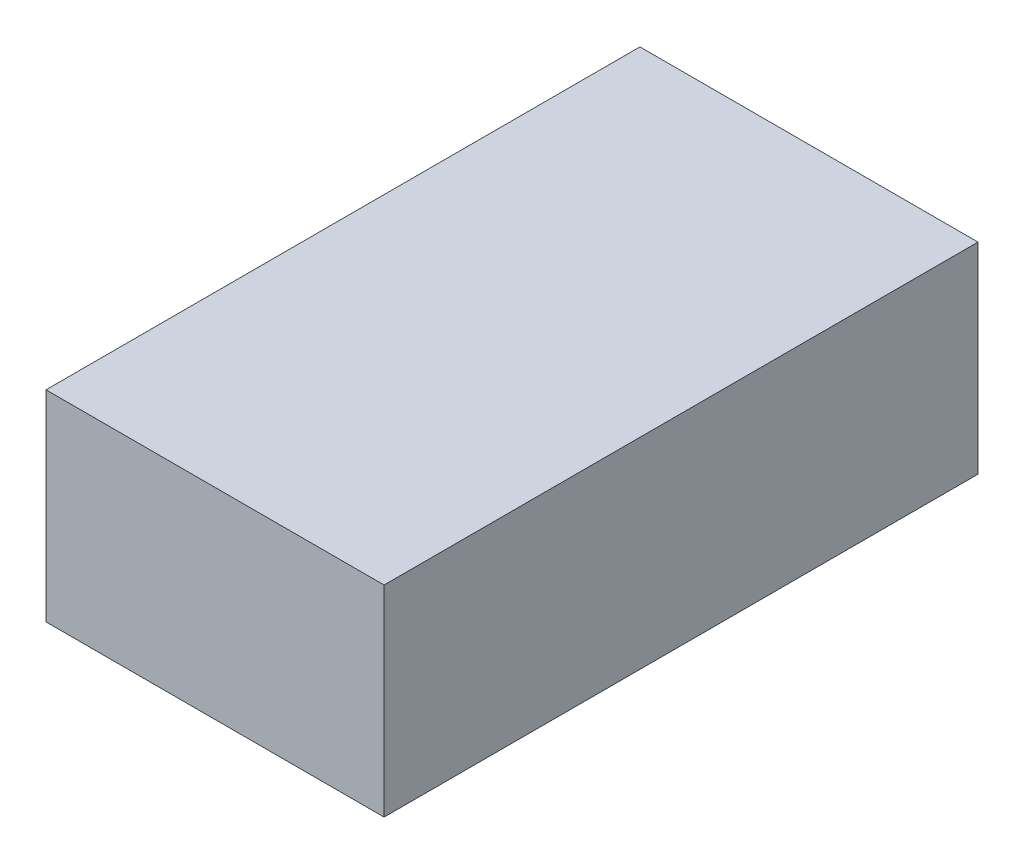
ISO-10303-21;
HEADER;
FILE_DESCRIPTION(('STEP AP214'),'2;1');
FILE_NAME('part.step','',(''),(''),'','','');
FILE_SCHEMA(('AUTOMOTIVE_DESIGN { 1 0 10303 214 1 1 1 1 }'));
ENDSEC;
DATA;
#1=APPLICATION_CONTEXT('core data for automotive mechanical design processes');
#2=APPLICATION_PROTOCOL_DEFINITION('international standard','automotive_design',2000,#1);
#3=PRODUCT_CONTEXT('',#1,'mechanical');
#4=PRODUCT('Part','Part','',(#3));
#5=PRODUCT_RELATED_PRODUCT_CATEGORY('part','',(#4));
#6=PRODUCT_DEFINITION_FORMATION('','',#4);
#7=PRODUCT_DEFINITION_CONTEXT('part definition',#1,'design');
#8=PRODUCT_DEFINITION('design','',#6,#7);
#9=PRODUCT_DEFINITION_SHAPE('','',#8);
#10=(LENGTH_UNIT() NAMED_UNIT(*) SI_UNIT(.MILLI.,.METRE.));
#11=(NAMED_UNIT(*) PLANE_ANGLE_UNIT() SI_UNIT($,.RADIAN.));
#12=(NAMED_UNIT(*) SI_UNIT($,.STERADIAN.) SOLID_ANGLE_UNIT());
#13=UNCERTAINTY_MEASURE_WITH_UNIT(LENGTH_MEASURE(1.E-05),#10,'distance_accuracy_value','');
#14=(GEOMETRIC_REPRESENTATION_CONTEXT(3) GLOBAL_UNCERTAINTY_ASSIGNED_CONTEXT((#13)) GLOBAL_UNIT_ASSIGNED_CONTEXT((#10,
#11,#12)) REPRESENTATION_CONTEXT('',''));
#15=CARTESIAN_POINT('',(0.,0.,0.));
#16=DIRECTION('',(0.,0.,1.));
#17=DIRECTION('',(1.,0.,0.));
#18=AXIS2_PLACEMENT_3D('',#15,#16,#17);
#19=CARTESIAN_POINT('',(18.5,-11.,32.5));
#20=DIRECTION('',(-1.,0.,0.));
#21=DIRECTION('',(0.,0.,1.));
#22=AXIS2_PLACEMENT_3D('',#19,#20,#21);
#23=PLANE('',#22);
#24=DIRECTION('',(0.,1.,0.));
#25=VECTOR('',#24,1.);
#26=CARTESIAN_POINT('',(18.5,-11.,-32.5));
#27=LINE('',#26,#25);
#28=CARTESIAN_POINT('',(18.5,-11.,-32.5));
#29=VERTEX_POINT('',#28);
#30=CARTESIAN_POINT('',(18.5,11.,-32.5));
#31=VERTEX_POINT('',#30);
#32=EDGE_CURVE('E100',#29,#31,#27,.T.);
#33=ORIENTED_EDGE('',*,*,#32,.T.);
#34=DIRECTION('',(0.,0.,-1.));
#35=VECTOR('',#34,1.);
#36=CARTESIAN_POINT('',(18.5,11.,32.5));
#37=LINE('',#36,#35);
#38=CARTESIAN_POINT('',(18.5,11.,32.5));
#39=VERTEX_POINT('',#38);
#40=EDGE_CURVE('E11',#39,#31,#37,.T.);
#41=ORIENTED_EDGE('',*,*,#40,.F.);
#42=DIRECTION('',(0.,1.,0.));
#43=VECTOR('',#42,1.);
#44=CARTESIAN_POINT('',(18.5,-11.,32.5));
#45=LINE('',#44,#43);
#46=CARTESIAN_POINT('',(18.5,-11.,32.5));
#47=VERTEX_POINT('',#46);
#48=EDGE_CURVE('E88',#47,#39,#45,.T.);
#49=ORIENTED_EDGE('',*,*,#48,.F.);
#50=DIRECTION('',(0.,0.,-1.));
#51=VECTOR('',#50,1.);
#52=CARTESIAN_POINT('',(18.5,-11.,32.5));
#53=LINE('',#52,#51);
#54=EDGE_CURVE('E96',#47,#29,#53,.T.);
#55=ORIENTED_EDGE('',*,*,#54,.T.);
#56=EDGE_LOOP('',(#33,#41,#49,#55));
#57=FACE_BOUND('',#56,.T.);
#58=ADVANCED_FACE('F37',(#57),#23,.F.);
#59=CARTESIAN_POINT('',(-18.5,11.,32.5));
#60=DIRECTION('',(0.,-1.,0.));
#61=DIRECTION('',(0.,0.,-1.));
#62=AXIS2_PLACEMENT_3D('',#59,#60,#61);
#63=PLANE('',#62);
#64=DIRECTION('',(-1.,0.,0.));
#65=VECTOR('',#64,1.);
#66=CARTESIAN_POINT('',(-18.5,11.,-32.5));
#67=LINE('',#66,#65);
#68=CARTESIAN_POINT('',(-18.5,11.,-32.5));
#69=VERTEX_POINT('',#68);
#70=EDGE_CURVE('E92',#31,#69,#67,.T.);
#71=ORIENTED_EDGE('',*,*,#70,.T.);
#72=DIRECTION('',(0.,0.,-1.));
#73=VECTOR('',#72,1.);
#74=CARTESIAN_POINT('',(-18.5,11.,32.5));
#75=LINE('',#74,#73);
#76=CARTESIAN_POINT('',(-18.5,11.,32.5));
#77=VERTEX_POINT('',#76);
#78=EDGE_CURVE('E45',#77,#69,#75,.T.);
#79=ORIENTED_EDGE('',*,*,#78,.F.);
#80=DIRECTION('',(-1.,0.,0.));
#81=VECTOR('',#80,1.);
#82=CARTESIAN_POINT('',(-18.5,11.,32.5));
#83=LINE('',#82,#81);
#84=EDGE_CURVE('E83',#39,#77,#83,.T.);
#85=ORIENTED_EDGE('',*,*,#84,.F.);
#86=ORIENTED_EDGE('',*,*,#40,.T.);
#87=EDGE_LOOP('',(#71,#79,#85,#86));
#88=FACE_BOUND('',#87,.T.);
#89=ADVANCED_FACE('F91',(#88),#63,.F.);
#90=CARTESIAN_POINT('',(-18.5,-11.,32.5));
#91=DIRECTION('',(1.,0.,0.));
#92=DIRECTION('',(0.,0.,-1.));
#93=AXIS2_PLACEMENT_3D('',#90,#91,#92);
#94=PLANE('',#93);
#95=DIRECTION('',(0.,-1.,0.));
#96=VECTOR('',#95,1.);
#97=CARTESIAN_POINT('',(-18.5,-11.,-32.5));
#98=LINE('',#97,#96);
#99=CARTESIAN_POINT('',(-18.5,-11.,-32.5));
#100=VERTEX_POINT('',#99);
#101=EDGE_CURVE('E70',#69,#100,#98,.T.);
#102=ORIENTED_EDGE('',*,*,#101,.T.);
#103=DIRECTION('',(0.,0.,-1.));
#104=VECTOR('',#103,1.);
#105=CARTESIAN_POINT('',(-18.5,-11.,32.5));
#106=LINE('',#105,#104);
#107=CARTESIAN_POINT('',(-18.5,-11.,32.5));
#108=VERTEX_POINT('',#107);
#109=EDGE_CURVE('E93',#108,#100,#106,.T.);
#110=ORIENTED_EDGE('',*,*,#109,.F.);
#111=DIRECTION('',(0.,-1.,0.));
#112=VECTOR('',#111,1.);
#113=CARTESIAN_POINT('',(-18.5,-11.,32.5));
#114=LINE('',#113,#112);
#115=EDGE_CURVE('E86',#77,#108,#114,.T.);
#116=ORIENTED_EDGE('',*,*,#115,.F.);
#117=ORIENTED_EDGE('',*,*,#78,.T.);
#118=EDGE_LOOP('',(#102,#110,#116,#117));
#119=FACE_BOUND('',#118,.T.);
#120=ADVANCED_FACE('F94',(#119),#94,.F.);
#121=CARTESIAN_POINT('',(-18.5,-11.,32.5));
#122=DIRECTION('',(0.,1.,0.));
#123=DIRECTION('',(0.,0.,1.));
#124=AXIS2_PLACEMENT_3D('',#121,#122,#123);
#125=PLANE('',#124);
#126=DIRECTION('',(1.,0.,0.));
#127=VECTOR('',#126,1.);
#128=CARTESIAN_POINT('',(-18.5,-11.,-32.5));
#129=LINE('',#128,#127);
#130=EDGE_CURVE('E76',#100,#29,#129,.T.);
#131=ORIENTED_EDGE('',*,*,#130,.T.);
#132=ORIENTED_EDGE('',*,*,#54,.F.);
#133=DIRECTION('',(1.,0.,0.));
#134=VECTOR('',#133,1.);
#135=CARTESIAN_POINT('',(-18.5,-11.,32.5));
#136=LINE('',#135,#134);
#137=EDGE_CURVE('E53',#108,#47,#136,.T.);
#138=ORIENTED_EDGE('',*,*,#137,.F.);
#139=ORIENTED_EDGE('',*,*,#109,.T.);
#140=EDGE_LOOP('',(#131,#132,#138,#139));
#141=FACE_BOUND('',#140,.T.);
#142=ADVANCED_FACE('F107',(#141),#125,.F.);
#143=CARTESIAN_POINT('',(0.,0.,32.5));
#144=DIRECTION('',(0.,0.,-1.));
#145=DIRECTION('',(-1.,0.,0.));
#146=AXIS2_PLACEMENT_3D('',#143,#144,#145);
#147=PLANE('',#146);
#148=ORIENTED_EDGE('',*,*,#48,.T.);
#149=ORIENTED_EDGE('',*,*,#84,.T.);
#150=ORIENTED_EDGE('',*,*,#115,.T.);
#151=ORIENTED_EDGE('',*,*,#137,.T.);
#152=EDGE_LOOP('',(#148,#149,#150,#151));
#153=FACE_BOUND('',#152,.T.);
#154=ADVANCED_FACE('F84',(#153),#147,.F.);
#155=CARTESIAN_POINT('',(0.,0.,-32.5));
#156=DIRECTION('',(0.,0.,-1.));
#157=DIRECTION('',(-1.,0.,0.));
#158=AXIS2_PLACEMENT_3D('',#155,#156,#157);
#159=PLANE('',#158);
#160=ORIENTED_EDGE('',*,*,#32,.F.);
#161=ORIENTED_EDGE('',*,*,#130,.F.);
#162=ORIENTED_EDGE('',*,*,#101,.F.);
#163=ORIENTED_EDGE('',*,*,#70,.F.);
#164=EDGE_LOOP('',(#160,#161,#162,#163));
#165=FACE_BOUND('',#164,.T.);
#166=ADVANCED_FACE('F110',(#165),#159,.T.);
#167=CLOSED_SHELL('',(#58,#89,#120,#142,#154,#166));
#168=MANIFOLD_SOLID_BREP('B2',#167);
#169=ADVANCED_BREP_SHAPE_REPRESENTATION('',(#18,#168),#14);
#170=SHAPE_DEFINITION_REPRESENTATION(#9,#169);
ENDSEC;
END-ISO-10303-21;
